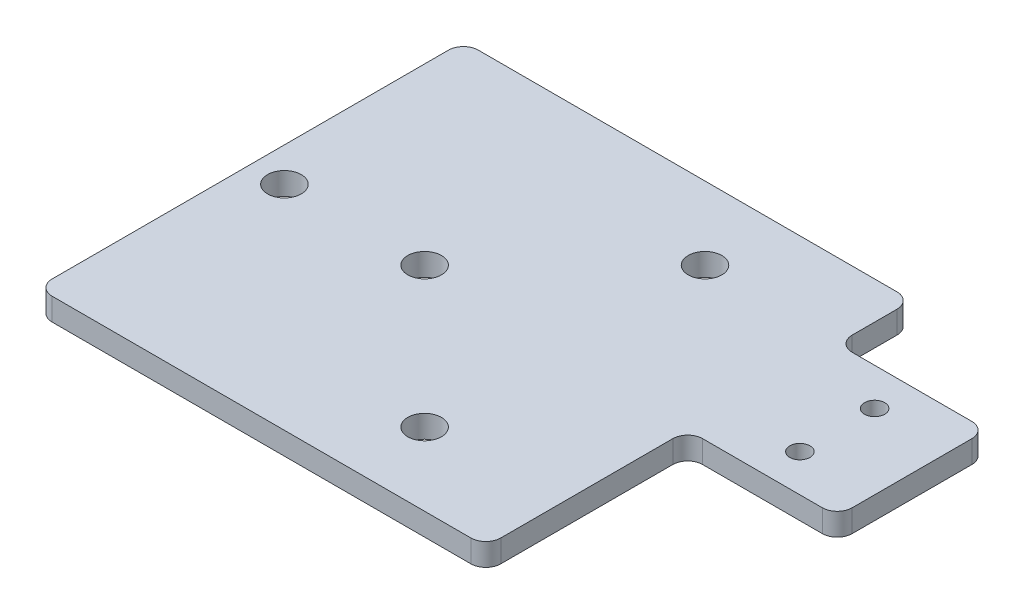
ISO-10303-21;
HEADER;
FILE_DESCRIPTION(('STEP AP214'),'2;1');
FILE_NAME('part.step','',(''),(''),'','','');
FILE_SCHEMA(('AUTOMOTIVE_DESIGN { 1 0 10303 214 1 1 1 1 }'));
ENDSEC;
DATA;
#1=APPLICATION_CONTEXT('core data for automotive mechanical design processes');
#2=APPLICATION_PROTOCOL_DEFINITION('international standard','automotive_design',2000,#1);
#3=PRODUCT_CONTEXT('',#1,'mechanical');
#4=PRODUCT('Part','Part','',(#3));
#5=PRODUCT_RELATED_PRODUCT_CATEGORY('part','',(#4));
#6=PRODUCT_DEFINITION_FORMATION('','',#4);
#7=PRODUCT_DEFINITION_CONTEXT('part definition',#1,'design');
#8=PRODUCT_DEFINITION('design','',#6,#7);
#9=PRODUCT_DEFINITION_SHAPE('','',#8);
#10=(LENGTH_UNIT() NAMED_UNIT(*) SI_UNIT(.MILLI.,.METRE.));
#11=(NAMED_UNIT(*) PLANE_ANGLE_UNIT() SI_UNIT($,.RADIAN.));
#12=(NAMED_UNIT(*) SI_UNIT($,.STERADIAN.) SOLID_ANGLE_UNIT());
#13=UNCERTAINTY_MEASURE_WITH_UNIT(LENGTH_MEASURE(1.E-05),#10,'distance_accuracy_value','');
#14=(GEOMETRIC_REPRESENTATION_CONTEXT(3) GLOBAL_UNCERTAINTY_ASSIGNED_CONTEXT((#13)) GLOBAL_UNIT_ASSIGNED_CONTEXT((#10,
#11,#12)) REPRESENTATION_CONTEXT('',''));
#15=CARTESIAN_POINT('',(0.,0.,0.));
#16=DIRECTION('',(0.,0.,1.));
#17=DIRECTION('',(1.,0.,0.));
#18=AXIS2_PLACEMENT_3D('',#15,#16,#17);
#19=CARTESIAN_POINT('',(30.,3.,-28.5));
#20=DIRECTION('',(-1.,0.,0.));
#21=DIRECTION('',(0.,0.,1.));
#22=AXIS2_PLACEMENT_3D('',#19,#20,#21);
#23=PLANE('',#22);
#24=DIRECTION('',(0.,0.,-1.));
#25=VECTOR('',#24,1.);
#26=CARTESIAN_POINT('',(30.,0.,-28.5));
#27=LINE('',#26,#25);
#28=CARTESIAN_POINT('',(30.,0.,-20.5));
#29=VERTEX_POINT('',#28);
#30=CARTESIAN_POINT('',(30.,0.,-26.5));
#31=VERTEX_POINT('',#30);
#32=EDGE_CURVE('E282',#29,#31,#27,.T.);
#33=ORIENTED_EDGE('',*,*,#32,.T.);
#34=DIRECTION('',(0.,-1.,0.));
#35=VECTOR('',#34,1.);
#36=CARTESIAN_POINT('',(30.,3.,-26.5));
#37=LINE('',#36,#35);
#38=CARTESIAN_POINT('',(30.,3.,-26.5));
#39=VERTEX_POINT('',#38);
#40=EDGE_CURVE('E232',#31,#39,#37,.F.);
#41=ORIENTED_EDGE('',*,*,#40,.T.);
#42=DIRECTION('',(0.,0.,-1.));
#43=VECTOR('',#42,1.);
#44=CARTESIAN_POINT('',(30.,3.,-28.5));
#45=LINE('',#44,#43);
#46=CARTESIAN_POINT('',(30.,3.,-20.5));
#47=VERTEX_POINT('',#46);
#48=EDGE_CURVE('E179',#47,#39,#45,.T.);
#49=ORIENTED_EDGE('',*,*,#48,.F.);
#50=DIRECTION('',(0.,1.,0.));
#51=VECTOR('',#50,1.);
#52=CARTESIAN_POINT('',(30.,3.,-20.5));
#53=LINE('',#52,#51);
#54=EDGE_CURVE('E230',#47,#29,#53,.F.);
#55=ORIENTED_EDGE('',*,*,#54,.T.);
#56=EDGE_LOOP('',(#33,#41,#49,#55));
#57=FACE_BOUND('',#56,.T.);
#58=ADVANCED_FACE('F39',(#57),#23,.F.);
#59=CARTESIAN_POINT('',(30.,0.,26.5));
#60=VERTEX_POINT('',#59);
#61=CARTESIAN_POINT('',(30.,0.,3.49999999999999));
#62=VERTEX_POINT('',#61);
#63=EDGE_CURVE('E277',#60,#62,#27,.T.);
#64=ORIENTED_EDGE('',*,*,#63,.T.);
#65=DIRECTION('',(0.,1.,0.));
#66=VECTOR('',#65,1.);
#67=CARTESIAN_POINT('',(30.,3.,3.5));
#68=LINE('',#67,#66);
#69=CARTESIAN_POINT('',(30.,3.,3.49999999999999));
#70=VERTEX_POINT('',#69);
#71=EDGE_CURVE('E252',#62,#70,#68,.T.);
#72=ORIENTED_EDGE('',*,*,#71,.T.);
#73=CARTESIAN_POINT('',(30.,3.,26.5));
#74=VERTEX_POINT('',#73);
#75=EDGE_CURVE('E182',#74,#70,#45,.T.);
#76=ORIENTED_EDGE('',*,*,#75,.F.);
#77=DIRECTION('',(0.,-1.,0.));
#78=VECTOR('',#77,1.);
#79=CARTESIAN_POINT('',(30.,3.,26.5));
#80=LINE('',#79,#78);
#81=EDGE_CURVE('E249',#74,#60,#80,.T.);
#82=ORIENTED_EDGE('',*,*,#81,.T.);
#83=EDGE_LOOP('',(#64,#72,#76,#82));
#84=FACE_BOUND('',#83,.T.);
#85=ADVANCED_FACE('F280',(#84),#23,.F.);
#86=CARTESIAN_POINT('',(-30.,3.,-28.5));
#87=DIRECTION('',(0.,0.,1.));
#88=DIRECTION('',(1.,0.,0.));
#89=AXIS2_PLACEMENT_3D('',#86,#87,#88);
#90=PLANE('',#89);
#91=DIRECTION('',(-1.,0.,0.));
#92=VECTOR('',#91,1.);
#93=CARTESIAN_POINT('',(-30.,0.,-28.5));
#94=LINE('',#93,#92);
#95=CARTESIAN_POINT('',(28.,0.,-28.5));
#96=VERTEX_POINT('',#95);
#97=CARTESIAN_POINT('',(-28.,0.,-28.5));
#98=VERTEX_POINT('',#97);
#99=EDGE_CURVE('E184',#96,#98,#94,.T.);
#100=ORIENTED_EDGE('',*,*,#99,.T.);
#101=DIRECTION('',(0.,-1.,0.));
#102=VECTOR('',#101,1.);
#103=CARTESIAN_POINT('',(-28.,3.,-28.5));
#104=LINE('',#103,#102);
#105=CARTESIAN_POINT('',(-28.,3.,-28.5));
#106=VERTEX_POINT('',#105);
#107=EDGE_CURVE('E54',#98,#106,#104,.F.);
#108=ORIENTED_EDGE('',*,*,#107,.T.);
#109=DIRECTION('',(-1.,0.,0.));
#110=VECTOR('',#109,1.);
#111=CARTESIAN_POINT('',(-30.,3.,-28.5));
#112=LINE('',#111,#110);
#113=CARTESIAN_POINT('',(28.,3.,-28.5));
#114=VERTEX_POINT('',#113);
#115=EDGE_CURVE('E290',#114,#106,#112,.T.);
#116=ORIENTED_EDGE('',*,*,#115,.F.);
#117=DIRECTION('',(0.,-1.,0.));
#118=VECTOR('',#117,1.);
#119=CARTESIAN_POINT('',(28.,3.,-28.5));
#120=LINE('',#119,#118);
#121=EDGE_CURVE('E226',#114,#96,#120,.T.);
#122=ORIENTED_EDGE('',*,*,#121,.T.);
#123=EDGE_LOOP('',(#100,#108,#116,#122));
#124=FACE_BOUND('',#123,.T.);
#125=ADVANCED_FACE('F364',(#124),#90,.F.);
#126=CARTESIAN_POINT('',(-30.,3.,-28.5));
#127=DIRECTION('',(1.,0.,0.));
#128=DIRECTION('',(0.,0.,-1.));
#129=AXIS2_PLACEMENT_3D('',#126,#127,#128);
#130=PLANE('',#129);
#131=DIRECTION('',(0.,0.,1.));
#132=VECTOR('',#131,1.);
#133=CARTESIAN_POINT('',(-30.,0.,-28.5));
#134=LINE('',#133,#132);
#135=CARTESIAN_POINT('',(-30.,0.,-26.5));
#136=VERTEX_POINT('',#135);
#137=CARTESIAN_POINT('',(-30.,0.,26.5));
#138=VERTEX_POINT('',#137);
#139=EDGE_CURVE('E180',#136,#138,#134,.T.);
#140=ORIENTED_EDGE('',*,*,#139,.T.);
#141=DIRECTION('',(0.,-1.,0.));
#142=VECTOR('',#141,1.);
#143=CARTESIAN_POINT('',(-30.,3.,26.5));
#144=LINE('',#143,#142);
#145=CARTESIAN_POINT('',(-30.,3.,26.5));
#146=VERTEX_POINT('',#145);
#147=EDGE_CURVE('E158',#138,#146,#144,.F.);
#148=ORIENTED_EDGE('',*,*,#147,.T.);
#149=DIRECTION('',(0.,0.,1.));
#150=VECTOR('',#149,1.);
#151=CARTESIAN_POINT('',(-30.,3.,-28.5));
#152=LINE('',#151,#150);
#153=CARTESIAN_POINT('',(-30.,3.,-26.5));
#154=VERTEX_POINT('',#153);
#155=EDGE_CURVE('E288',#154,#146,#152,.T.);
#156=ORIENTED_EDGE('',*,*,#155,.F.);
#157=DIRECTION('',(0.,-1.,0.));
#158=VECTOR('',#157,1.);
#159=CARTESIAN_POINT('',(-30.,3.,-26.5));
#160=LINE('',#159,#158);
#161=EDGE_CURVE('E163',#154,#136,#160,.T.);
#162=ORIENTED_EDGE('',*,*,#161,.T.);
#163=EDGE_LOOP('',(#140,#148,#156,#162));
#164=FACE_BOUND('',#163,.T.);
#165=ADVANCED_FACE('F401',(#164),#130,.F.);
#166=CARTESIAN_POINT('',(-30.,3.,28.5));
#167=DIRECTION('',(0.,0.,-1.));
#168=DIRECTION('',(-1.,0.,0.));
#169=AXIS2_PLACEMENT_3D('',#166,#167,#168);
#170=PLANE('',#169);
#171=DIRECTION('',(1.,0.,0.));
#172=VECTOR('',#171,1.);
#173=CARTESIAN_POINT('',(-30.,3.,28.5));
#174=LINE('',#173,#172);
#175=CARTESIAN_POINT('',(-28.,3.,28.5));
#176=VERTEX_POINT('',#175);
#177=CARTESIAN_POINT('',(28.,3.,28.5));
#178=VERTEX_POINT('',#177);
#179=EDGE_CURVE('E173',#176,#178,#174,.T.);
#180=ORIENTED_EDGE('',*,*,#179,.F.);
#181=DIRECTION('',(0.,-1.,0.));
#182=VECTOR('',#181,1.);
#183=CARTESIAN_POINT('',(-28.,3.,28.5));
#184=LINE('',#183,#182);
#185=CARTESIAN_POINT('',(-28.,0.,28.5));
#186=VERTEX_POINT('',#185);
#187=EDGE_CURVE('E157',#176,#186,#184,.T.);
#188=ORIENTED_EDGE('',*,*,#187,.T.);
#189=DIRECTION('',(1.,0.,0.));
#190=VECTOR('',#189,1.);
#191=CARTESIAN_POINT('',(-30.,0.,28.5));
#192=LINE('',#191,#190);
#193=CARTESIAN_POINT('',(28.,0.,28.5));
#194=VERTEX_POINT('',#193);
#195=EDGE_CURVE('E170',#186,#194,#192,.T.);
#196=ORIENTED_EDGE('',*,*,#195,.T.);
#197=DIRECTION('',(0.,-1.,0.));
#198=VECTOR('',#197,1.);
#199=CARTESIAN_POINT('',(28.,3.,28.5));
#200=LINE('',#199,#198);
#201=EDGE_CURVE('E175',#194,#178,#200,.F.);
#202=ORIENTED_EDGE('',*,*,#201,.T.);
#203=EDGE_LOOP('',(#180,#188,#196,#202));
#204=FACE_BOUND('',#203,.T.);
#205=ADVANCED_FACE('F169',(#204),#170,.F.);
#206=CARTESIAN_POINT('',(0.,3.,0.));
#207=DIRECTION('',(0.,1.,0.));
#208=DIRECTION('',(0.,0.,1.));
#209=AXIS2_PLACEMENT_3D('',#206,#207,#208);
#210=PLANE('',#209);
#211=CARTESIAN_POINT('',(40.,3.,-3.5));
#212=DIRECTION('',(0.,1.,0.));
#213=DIRECTION('',(0.,0.,1.));
#214=AXIS2_PLACEMENT_3D('',#211,#212,#213);
#215=CIRCLE('',#214,1.35);
#216=CARTESIAN_POINT('',(40.,3.,-2.15000000000001));
#217=VERTEX_POINT('',#216);
#218=EDGE_CURVE('E322',#217,#217,#215,.T.);
#219=ORIENTED_EDGE('',*,*,#218,.F.);
#220=EDGE_LOOP('',(#219));
#221=FACE_BOUND('',#220,.T.);
#222=CARTESIAN_POINT('',(40.,3.,-13.5));
#223=DIRECTION('',(0.,1.,0.));
#224=DIRECTION('',(0.,0.,1.));
#225=AXIS2_PLACEMENT_3D('',#222,#223,#224);
#226=CIRCLE('',#225,1.35);
#227=CARTESIAN_POINT('',(40.,3.,-12.15));
#228=VERTEX_POINT('',#227);
#229=EDGE_CURVE('E202',#228,#228,#226,.T.);
#230=ORIENTED_EDGE('',*,*,#229,.F.);
#231=EDGE_LOOP('',(#230));
#232=FACE_BOUND('',#231,.T.);
#233=CARTESIAN_POINT('',(-25.437,3.,0.));
#234=DIRECTION('',(0.,1.,0.));
#235=DIRECTION('',(0.,0.,1.));
#236=AXIS2_PLACEMENT_3D('',#233,#234,#235);
#237=CIRCLE('',#236,2.25);
#238=CARTESIAN_POINT('',(-25.437,3.,2.25));
#239=VERTEX_POINT('',#238);
#240=EDGE_CURVE('E197',#239,#239,#237,.T.);
#241=ORIENTED_EDGE('',*,*,#240,.F.);
#242=EDGE_LOOP('',(#241));
#243=FACE_BOUND('',#242,.T.);
#244=CARTESIAN_POINT('',(-6.68699999999999,3.,0.));
#245=DIRECTION('',(0.,1.,0.));
#246=DIRECTION('',(0.,0.,1.));
#247=AXIS2_PLACEMENT_3D('',#244,#245,#246);
#248=CIRCLE('',#247,2.25);
#249=CARTESIAN_POINT('',(-6.68699999999999,3.,2.25));
#250=VERTEX_POINT('',#249);
#251=EDGE_CURVE('E196',#250,#250,#248,.T.);
#252=ORIENTED_EDGE('',*,*,#251,.F.);
#253=EDGE_LOOP('',(#252));
#254=FACE_BOUND('',#253,.T.);
#255=CARTESIAN_POINT('',(12.063,3.,-18.75));
#256=DIRECTION('',(0.,1.,0.));
#257=DIRECTION('',(0.,0.,1.));
#258=AXIS2_PLACEMENT_3D('',#255,#256,#257);
#259=CIRCLE('',#258,2.25);
#260=CARTESIAN_POINT('',(12.063,3.,-16.5));
#261=VERTEX_POINT('',#260);
#262=EDGE_CURVE('E192',#261,#261,#259,.T.);
#263=ORIENTED_EDGE('',*,*,#262,.F.);
#264=EDGE_LOOP('',(#263));
#265=FACE_BOUND('',#264,.T.);
#266=CARTESIAN_POINT('',(12.063,3.,18.75));
#267=DIRECTION('',(0.,1.,0.));
#268=DIRECTION('',(0.,0.,1.));
#269=AXIS2_PLACEMENT_3D('',#266,#267,#268);
#270=CIRCLE('',#269,2.25);
#271=CARTESIAN_POINT('',(12.063,3.,21.));
#272=VERTEX_POINT('',#271);
#273=EDGE_CURVE('E191',#272,#272,#270,.T.);
#274=ORIENTED_EDGE('',*,*,#273,.F.);
#275=EDGE_LOOP('',(#274));
#276=FACE_BOUND('',#275,.T.);
#277=ORIENTED_EDGE('',*,*,#155,.T.);
#278=CARTESIAN_POINT('',(-28.,3.,26.5));
#279=DIRECTION('',(0.,1.,0.));
#280=DIRECTION('',(0.,0.,1.));
#281=AXIS2_PLACEMENT_3D('',#278,#279,#280);
#282=CIRCLE('',#281,2.);
#283=EDGE_CURVE('E224',#146,#176,#282,.T.);
#284=ORIENTED_EDGE('',*,*,#283,.T.);
#285=ORIENTED_EDGE('',*,*,#179,.T.);
#286=CARTESIAN_POINT('',(28.,3.,26.5));
#287=DIRECTION('',(0.,1.,0.));
#288=DIRECTION('',(0.,0.,1.));
#289=AXIS2_PLACEMENT_3D('',#286,#287,#288);
#290=CIRCLE('',#289,2.);
#291=EDGE_CURVE('E215',#178,#74,#290,.T.);
#292=ORIENTED_EDGE('',*,*,#291,.T.);
#293=ORIENTED_EDGE('',*,*,#75,.T.);
#294=CARTESIAN_POINT('',(32.,3.,3.5));
#295=DIRECTION('',(0.,1.,0.));
#296=DIRECTION('',(0.,0.,1.));
#297=AXIS2_PLACEMENT_3D('',#294,#295,#296);
#298=CIRCLE('',#297,2.);
#299=CARTESIAN_POINT('',(32.,3.,1.5));
#300=VERTEX_POINT('',#299);
#301=EDGE_CURVE('E47',#70,#300,#298,.F.);
#302=ORIENTED_EDGE('',*,*,#301,.T.);
#303=DIRECTION('',(1.,0.,0.));
#304=VECTOR('',#303,1.);
#305=CARTESIAN_POINT('',(50.,3.,1.5));
#306=LINE('',#305,#304);
#307=CARTESIAN_POINT('',(48.,3.,1.5));
#308=VERTEX_POINT('',#307);
#309=EDGE_CURVE('E201',#300,#308,#306,.T.);
#310=ORIENTED_EDGE('',*,*,#309,.T.);
#311=CARTESIAN_POINT('',(48.,3.,-0.500000000000002));
#312=DIRECTION('',(0.,1.,0.));
#313=DIRECTION('',(0.,0.,1.));
#314=AXIS2_PLACEMENT_3D('',#311,#312,#313);
#315=CIRCLE('',#314,2.);
#316=CARTESIAN_POINT('',(50.,3.,-0.500000000000003));
#317=VERTEX_POINT('',#316);
#318=EDGE_CURVE('E217',#308,#317,#315,.T.);
#319=ORIENTED_EDGE('',*,*,#318,.T.);
#320=DIRECTION('',(0.,0.,-1.));
#321=VECTOR('',#320,1.);
#322=CARTESIAN_POINT('',(50.,3.,1.5));
#323=LINE('',#322,#321);
#324=CARTESIAN_POINT('',(50.,3.,-16.5));
#325=VERTEX_POINT('',#324);
#326=EDGE_CURVE('E272',#317,#325,#323,.T.);
#327=ORIENTED_EDGE('',*,*,#326,.T.);
#328=CARTESIAN_POINT('',(48.,3.,-16.5));
#329=DIRECTION('',(0.,1.,0.));
#330=DIRECTION('',(0.,0.,1.));
#331=AXIS2_PLACEMENT_3D('',#328,#329,#330);
#332=CIRCLE('',#331,2.);
#333=CARTESIAN_POINT('',(48.,3.,-18.5));
#334=VERTEX_POINT('',#333);
#335=EDGE_CURVE('E219',#325,#334,#332,.T.);
#336=ORIENTED_EDGE('',*,*,#335,.T.);
#337=DIRECTION('',(-1.,0.,0.));
#338=VECTOR('',#337,1.);
#339=CARTESIAN_POINT('',(50.,3.,-18.5));
#340=LINE('',#339,#338);
#341=CARTESIAN_POINT('',(32.,3.,-18.5));
#342=VERTEX_POINT('',#341);
#343=EDGE_CURVE('E306',#334,#342,#340,.T.);
#344=ORIENTED_EDGE('',*,*,#343,.T.);
#345=CARTESIAN_POINT('',(32.,3.,-20.5));
#346=DIRECTION('',(0.,1.,0.));
#347=DIRECTION('',(0.,0.,1.));
#348=AXIS2_PLACEMENT_3D('',#345,#346,#347);
#349=CIRCLE('',#348,2.);
#350=EDGE_CURVE('E255',#342,#47,#349,.F.);
#351=ORIENTED_EDGE('',*,*,#350,.T.);
#352=ORIENTED_EDGE('',*,*,#48,.T.);
#353=CARTESIAN_POINT('',(28.,3.,-26.5));
#354=DIRECTION('',(0.,1.,0.));
#355=DIRECTION('',(0.,0.,1.));
#356=AXIS2_PLACEMENT_3D('',#353,#354,#355);
#357=CIRCLE('',#356,2.);
#358=EDGE_CURVE('E61',#39,#114,#357,.T.);
#359=ORIENTED_EDGE('',*,*,#358,.T.);
#360=ORIENTED_EDGE('',*,*,#115,.T.);
#361=CARTESIAN_POINT('',(-28.,3.,-26.5));
#362=DIRECTION('',(0.,1.,0.));
#363=DIRECTION('',(0.,0.,1.));
#364=AXIS2_PLACEMENT_3D('',#361,#362,#363);
#365=CIRCLE('',#364,2.);
#366=EDGE_CURVE('E222',#106,#154,#365,.T.);
#367=ORIENTED_EDGE('',*,*,#366,.T.);
#368=EDGE_LOOP('',(#277,#284,#285,#292,#293,#302,#310,#319,#327,#336,#344,#351,#352,#359,#360,#367));
#369=FACE_BOUND('',#368,.T.);
#370=ADVANCED_FACE('F262',(#221,#232,#243,#254,#265,#276,#369),#210,.T.);
#371=CARTESIAN_POINT('',(0.,0.,0.));
#372=DIRECTION('',(0.,1.,0.));
#373=DIRECTION('',(0.,0.,1.));
#374=AXIS2_PLACEMENT_3D('',#371,#372,#373);
#375=PLANE('',#374);
#376=CARTESIAN_POINT('',(40.,0.,-3.5));
#377=DIRECTION('',(0.,1.,0.));
#378=DIRECTION('',(0.,0.,1.));
#379=AXIS2_PLACEMENT_3D('',#376,#377,#378);
#380=CIRCLE('',#379,1.35);
#381=CARTESIAN_POINT('',(40.,0.,-2.15000000000001));
#382=VERTEX_POINT('',#381);
#383=EDGE_CURVE('E319',#382,#382,#380,.T.);
#384=ORIENTED_EDGE('',*,*,#383,.T.);
#385=EDGE_LOOP('',(#384));
#386=FACE_BOUND('',#385,.T.);
#387=CARTESIAN_POINT('',(40.,0.,-13.5));
#388=DIRECTION('',(0.,1.,0.));
#389=DIRECTION('',(0.,0.,1.));
#390=AXIS2_PLACEMENT_3D('',#387,#388,#389);
#391=CIRCLE('',#390,1.35);
#392=CARTESIAN_POINT('',(40.,0.,-12.15));
#393=VERTEX_POINT('',#392);
#394=EDGE_CURVE('E198',#393,#393,#391,.T.);
#395=ORIENTED_EDGE('',*,*,#394,.T.);
#396=EDGE_LOOP('',(#395));
#397=FACE_BOUND('',#396,.T.);
#398=CARTESIAN_POINT('',(-25.437,0.,0.));
#399=DIRECTION('',(0.,1.,0.));
#400=DIRECTION('',(0.,0.,1.));
#401=AXIS2_PLACEMENT_3D('',#398,#399,#400);
#402=CIRCLE('',#401,2.25);
#403=CARTESIAN_POINT('',(-25.437,0.,2.25));
#404=VERTEX_POINT('',#403);
#405=EDGE_CURVE('E193',#404,#404,#402,.T.);
#406=ORIENTED_EDGE('',*,*,#405,.T.);
#407=EDGE_LOOP('',(#406));
#408=FACE_BOUND('',#407,.T.);
#409=CARTESIAN_POINT('',(-6.68699999999999,0.,0.));
#410=DIRECTION('',(0.,1.,0.));
#411=DIRECTION('',(0.,0.,1.));
#412=AXIS2_PLACEMENT_3D('',#409,#410,#411);
#413=CIRCLE('',#412,2.25);
#414=CARTESIAN_POINT('',(-6.68699999999999,0.,2.25));
#415=VERTEX_POINT('',#414);
#416=EDGE_CURVE('E298',#415,#415,#413,.T.);
#417=ORIENTED_EDGE('',*,*,#416,.T.);
#418=EDGE_LOOP('',(#417));
#419=FACE_BOUND('',#418,.T.);
#420=CARTESIAN_POINT('',(12.063,0.,-18.75));
#421=DIRECTION('',(0.,1.,0.));
#422=DIRECTION('',(0.,0.,1.));
#423=AXIS2_PLACEMENT_3D('',#420,#421,#422);
#424=CIRCLE('',#423,2.25);
#425=CARTESIAN_POINT('',(12.063,0.,-16.5));
#426=VERTEX_POINT('',#425);
#427=EDGE_CURVE('E188',#426,#426,#424,.T.);
#428=ORIENTED_EDGE('',*,*,#427,.T.);
#429=EDGE_LOOP('',(#428));
#430=FACE_BOUND('',#429,.T.);
#431=CARTESIAN_POINT('',(12.063,0.,18.75));
#432=DIRECTION('',(0.,1.,0.));
#433=DIRECTION('',(0.,0.,1.));
#434=AXIS2_PLACEMENT_3D('',#431,#432,#433);
#435=CIRCLE('',#434,2.25);
#436=CARTESIAN_POINT('',(12.063,0.,21.));
#437=VERTEX_POINT('',#436);
#438=EDGE_CURVE('E285',#437,#437,#435,.T.);
#439=ORIENTED_EDGE('',*,*,#438,.T.);
#440=EDGE_LOOP('',(#439));
#441=FACE_BOUND('',#440,.T.);
#442=ORIENTED_EDGE('',*,*,#195,.F.);
#443=CARTESIAN_POINT('',(-28.,0.,26.5));
#444=DIRECTION('',(0.,1.,0.));
#445=DIRECTION('',(0.,0.,1.));
#446=AXIS2_PLACEMENT_3D('',#443,#444,#445);
#447=CIRCLE('',#446,2.);
#448=EDGE_CURVE('E153',#186,#138,#447,.F.);
#449=ORIENTED_EDGE('',*,*,#448,.T.);
#450=ORIENTED_EDGE('',*,*,#139,.F.);
#451=CARTESIAN_POINT('',(-28.,0.,-26.5));
#452=DIRECTION('',(0.,1.,0.));
#453=DIRECTION('',(0.,0.,1.));
#454=AXIS2_PLACEMENT_3D('',#451,#452,#453);
#455=CIRCLE('',#454,2.);
#456=EDGE_CURVE('E164',#136,#98,#455,.F.);
#457=ORIENTED_EDGE('',*,*,#456,.T.);
#458=ORIENTED_EDGE('',*,*,#99,.F.);
#459=CARTESIAN_POINT('',(28.,0.,-26.5));
#460=DIRECTION('',(0.,1.,0.));
#461=DIRECTION('',(0.,0.,1.));
#462=AXIS2_PLACEMENT_3D('',#459,#460,#461);
#463=CIRCLE('',#462,2.);
#464=EDGE_CURVE('E209',#96,#31,#463,.F.);
#465=ORIENTED_EDGE('',*,*,#464,.T.);
#466=ORIENTED_EDGE('',*,*,#32,.F.);
#467=CARTESIAN_POINT('',(32.,0.,-20.5));
#468=DIRECTION('',(0.,1.,0.));
#469=DIRECTION('',(0.,0.,1.));
#470=AXIS2_PLACEMENT_3D('',#467,#468,#469);
#471=CIRCLE('',#470,2.);
#472=CARTESIAN_POINT('',(32.,0.,-18.5));
#473=VERTEX_POINT('',#472);
#474=EDGE_CURVE('E257',#29,#473,#471,.T.);
#475=ORIENTED_EDGE('',*,*,#474,.T.);
#476=DIRECTION('',(-1.,0.,0.));
#477=VECTOR('',#476,1.);
#478=CARTESIAN_POINT('',(50.,0.,-18.5));
#479=LINE('',#478,#477);
#480=CARTESIAN_POINT('',(48.,0.,-18.5));
#481=VERTEX_POINT('',#480);
#482=EDGE_CURVE('E305',#481,#473,#479,.T.);
#483=ORIENTED_EDGE('',*,*,#482,.F.);
#484=CARTESIAN_POINT('',(48.,0.,-16.5));
#485=DIRECTION('',(0.,1.,0.));
#486=DIRECTION('',(0.,0.,1.));
#487=AXIS2_PLACEMENT_3D('',#484,#485,#486);
#488=CIRCLE('',#487,2.);
#489=CARTESIAN_POINT('',(50.,0.,-16.5));
#490=VERTEX_POINT('',#489);
#491=EDGE_CURVE('E207',#481,#490,#488,.F.);
#492=ORIENTED_EDGE('',*,*,#491,.T.);
#493=DIRECTION('',(0.,0.,-1.));
#494=VECTOR('',#493,1.);
#495=CARTESIAN_POINT('',(50.,0.,1.5));
#496=LINE('',#495,#494);
#497=CARTESIAN_POINT('',(50.,0.,-0.500000000000003));
#498=VERTEX_POINT('',#497);
#499=EDGE_CURVE('E313',#498,#490,#496,.T.);
#500=ORIENTED_EDGE('',*,*,#499,.F.);
#501=CARTESIAN_POINT('',(48.,0.,-0.500000000000002));
#502=DIRECTION('',(0.,1.,0.));
#503=DIRECTION('',(0.,0.,1.));
#504=AXIS2_PLACEMENT_3D('',#501,#502,#503);
#505=CIRCLE('',#504,2.);
#506=CARTESIAN_POINT('',(48.,0.,1.5));
#507=VERTEX_POINT('',#506);
#508=EDGE_CURVE('E205',#498,#507,#505,.F.);
#509=ORIENTED_EDGE('',*,*,#508,.T.);
#510=DIRECTION('',(1.,0.,0.));
#511=VECTOR('',#510,1.);
#512=CARTESIAN_POINT('',(50.,0.,1.5));
#513=LINE('',#512,#511);
#514=CARTESIAN_POINT('',(32.,0.,1.5));
#515=VERTEX_POINT('',#514);
#516=EDGE_CURVE('E278',#515,#507,#513,.T.);
#517=ORIENTED_EDGE('',*,*,#516,.F.);
#518=CARTESIAN_POINT('',(32.,0.,3.5));
#519=DIRECTION('',(0.,1.,0.));
#520=DIRECTION('',(0.,0.,1.));
#521=AXIS2_PLACEMENT_3D('',#518,#519,#520);
#522=CIRCLE('',#521,2.);
#523=EDGE_CURVE('E11',#515,#62,#522,.T.);
#524=ORIENTED_EDGE('',*,*,#523,.T.);
#525=ORIENTED_EDGE('',*,*,#63,.F.);
#526=CARTESIAN_POINT('',(28.,0.,26.5));
#527=DIRECTION('',(0.,1.,0.));
#528=DIRECTION('',(0.,0.,1.));
#529=AXIS2_PLACEMENT_3D('',#526,#527,#528);
#530=CIRCLE('',#529,2.);
#531=EDGE_CURVE('E174',#60,#194,#530,.F.);
#532=ORIENTED_EDGE('',*,*,#531,.T.);
#533=EDGE_LOOP('',(#442,#449,#450,#457,#458,#465,#466,#475,#483,#492,#500,#509,#517,#524,#525,#532));
#534=FACE_BOUND('',#533,.T.);
#535=ADVANCED_FACE('F177',(#386,#397,#408,#419,#430,#441,#534),#375,.F.);
#536=CARTESIAN_POINT('',(12.063,3.,18.75));
#537=DIRECTION('',(0.,1.,0.));
#538=DIRECTION('',(0.,0.,1.));
#539=AXIS2_PLACEMENT_3D('',#536,#537,#538);
#540=CYLINDRICAL_SURFACE('',#539,2.25);
#541=ORIENTED_EDGE('',*,*,#273,.T.);
#542=EDGE_LOOP('',(#541));
#543=FACE_BOUND('',#542,.T.);
#544=ORIENTED_EDGE('',*,*,#438,.F.);
#545=EDGE_LOOP('',(#544));
#546=FACE_BOUND('',#545,.T.);
#547=ADVANCED_FACE('F342',(#543,#546),#540,.F.);
#548=CARTESIAN_POINT('',(12.063,3.,-18.75));
#549=DIRECTION('',(0.,1.,0.));
#550=DIRECTION('',(0.,0.,1.));
#551=AXIS2_PLACEMENT_3D('',#548,#549,#550);
#552=CYLINDRICAL_SURFACE('',#551,2.25);
#553=ORIENTED_EDGE('',*,*,#262,.T.);
#554=EDGE_LOOP('',(#553));
#555=FACE_BOUND('',#554,.T.);
#556=ORIENTED_EDGE('',*,*,#427,.F.);
#557=EDGE_LOOP('',(#556));
#558=FACE_BOUND('',#557,.T.);
#559=ADVANCED_FACE('F345',(#555,#558),#552,.F.);
#560=CARTESIAN_POINT('',(-6.68699999999999,3.,0.));
#561=DIRECTION('',(0.,1.,0.));
#562=DIRECTION('',(0.,0.,1.));
#563=AXIS2_PLACEMENT_3D('',#560,#561,#562);
#564=CYLINDRICAL_SURFACE('',#563,2.25);
#565=ORIENTED_EDGE('',*,*,#251,.T.);
#566=EDGE_LOOP('',(#565));
#567=FACE_BOUND('',#566,.T.);
#568=ORIENTED_EDGE('',*,*,#416,.F.);
#569=EDGE_LOOP('',(#568));
#570=FACE_BOUND('',#569,.T.);
#571=ADVANCED_FACE('F436',(#567,#570),#564,.F.);
#572=CARTESIAN_POINT('',(-25.437,3.,0.));
#573=DIRECTION('',(0.,1.,0.));
#574=DIRECTION('',(0.,0.,1.));
#575=AXIS2_PLACEMENT_3D('',#572,#573,#574);
#576=CYLINDRICAL_SURFACE('',#575,2.25);
#577=ORIENTED_EDGE('',*,*,#240,.T.);
#578=EDGE_LOOP('',(#577));
#579=FACE_BOUND('',#578,.T.);
#580=ORIENTED_EDGE('',*,*,#405,.F.);
#581=EDGE_LOOP('',(#580));
#582=FACE_BOUND('',#581,.T.);
#583=ADVANCED_FACE('F430',(#579,#582),#576,.F.);
#584=CARTESIAN_POINT('',(50.,0.,-18.5));
#585=DIRECTION('',(0.,0.,-1.));
#586=DIRECTION('',(-1.,0.,0.));
#587=AXIS2_PLACEMENT_3D('',#584,#585,#586);
#588=PLANE('',#587);
#589=ORIENTED_EDGE('',*,*,#482,.T.);
#590=DIRECTION('',(0.,1.,0.));
#591=VECTOR('',#590,1.);
#592=CARTESIAN_POINT('',(32.,0.,-18.5));
#593=LINE('',#592,#591);
#594=EDGE_CURVE('E236',#473,#342,#593,.T.);
#595=ORIENTED_EDGE('',*,*,#594,.T.);
#596=ORIENTED_EDGE('',*,*,#343,.F.);
#597=DIRECTION('',(0.,1.,0.));
#598=VECTOR('',#597,1.);
#599=CARTESIAN_POINT('',(48.,0.,-18.5));
#600=LINE('',#599,#598);
#601=EDGE_CURVE('E234',#334,#481,#600,.F.);
#602=ORIENTED_EDGE('',*,*,#601,.T.);
#603=EDGE_LOOP('',(#589,#595,#596,#602));
#604=FACE_BOUND('',#603,.T.);
#605=ADVANCED_FACE('F413',(#604),#588,.T.);
#606=CARTESIAN_POINT('',(50.,0.,1.5));
#607=DIRECTION('',(1.,0.,0.));
#608=DIRECTION('',(0.,0.,-1.));
#609=AXIS2_PLACEMENT_3D('',#606,#607,#608);
#610=PLANE('',#609);
#611=ORIENTED_EDGE('',*,*,#499,.T.);
#612=DIRECTION('',(0.,1.,0.));
#613=VECTOR('',#612,1.);
#614=CARTESIAN_POINT('',(50.,0.,-16.5));
#615=LINE('',#614,#613);
#616=EDGE_CURVE('E241',#490,#325,#615,.T.);
#617=ORIENTED_EDGE('',*,*,#616,.T.);
#618=ORIENTED_EDGE('',*,*,#326,.F.);
#619=DIRECTION('',(0.,1.,0.));
#620=VECTOR('',#619,1.);
#621=CARTESIAN_POINT('',(50.,0.,-0.500000000000003));
#622=LINE('',#621,#620);
#623=EDGE_CURVE('E239',#317,#498,#622,.F.);
#624=ORIENTED_EDGE('',*,*,#623,.T.);
#625=EDGE_LOOP('',(#611,#617,#618,#624));
#626=FACE_BOUND('',#625,.T.);
#627=ADVANCED_FACE('F420',(#626),#610,.T.);
#628=CARTESIAN_POINT('',(50.,0.,1.5));
#629=DIRECTION('',(0.,0.,1.));
#630=DIRECTION('',(1.,0.,0.));
#631=AXIS2_PLACEMENT_3D('',#628,#629,#630);
#632=PLANE('',#631);
#633=ORIENTED_EDGE('',*,*,#516,.T.);
#634=DIRECTION('',(0.,1.,0.));
#635=VECTOR('',#634,1.);
#636=CARTESIAN_POINT('',(48.,0.,1.5));
#637=LINE('',#636,#635);
#638=EDGE_CURVE('E246',#507,#308,#637,.T.);
#639=ORIENTED_EDGE('',*,*,#638,.T.);
#640=ORIENTED_EDGE('',*,*,#309,.F.);
#641=DIRECTION('',(0.,1.,0.));
#642=VECTOR('',#641,1.);
#643=CARTESIAN_POINT('',(32.,0.,1.5));
#644=LINE('',#643,#642);
#645=EDGE_CURVE('E244',#300,#515,#644,.F.);
#646=ORIENTED_EDGE('',*,*,#645,.T.);
#647=EDGE_LOOP('',(#633,#639,#640,#646));
#648=FACE_BOUND('',#647,.T.);
#649=ADVANCED_FACE('F269',(#648),#632,.T.);
#650=CARTESIAN_POINT('',(40.,3.,-13.5));
#651=DIRECTION('',(0.,1.,0.));
#652=DIRECTION('',(0.,0.,1.));
#653=AXIS2_PLACEMENT_3D('',#650,#651,#652);
#654=CYLINDRICAL_SURFACE('',#653,1.35);
#655=ORIENTED_EDGE('',*,*,#229,.T.);
#656=EDGE_LOOP('',(#655));
#657=FACE_BOUND('',#656,.T.);
#658=ORIENTED_EDGE('',*,*,#394,.F.);
#659=EDGE_LOOP('',(#658));
#660=FACE_BOUND('',#659,.T.);
#661=ADVANCED_FACE('F428',(#657,#660),#654,.F.);
#662=CARTESIAN_POINT('',(40.,3.,-3.5));
#663=DIRECTION('',(0.,1.,0.));
#664=DIRECTION('',(0.,0.,1.));
#665=AXIS2_PLACEMENT_3D('',#662,#663,#664);
#666=CYLINDRICAL_SURFACE('',#665,1.35);
#667=ORIENTED_EDGE('',*,*,#218,.T.);
#668=EDGE_LOOP('',(#667));
#669=FACE_BOUND('',#668,.T.);
#670=ORIENTED_EDGE('',*,*,#383,.F.);
#671=EDGE_LOOP('',(#670));
#672=FACE_BOUND('',#671,.T.);
#673=ADVANCED_FACE('F326',(#669,#672),#666,.F.);
#674=CARTESIAN_POINT('',(-28.,3.,26.5));
#675=DIRECTION('',(0.,-1.,0.));
#676=DIRECTION('',(0.,0.,-1.));
#677=AXIS2_PLACEMENT_3D('',#674,#675,#676);
#678=CYLINDRICAL_SURFACE('',#677,2.);
#679=ORIENTED_EDGE('',*,*,#283,.F.);
#680=ORIENTED_EDGE('',*,*,#147,.F.);
#681=ORIENTED_EDGE('',*,*,#448,.F.);
#682=ORIENTED_EDGE('',*,*,#187,.F.);
#683=EDGE_LOOP('',(#679,#680,#681,#682));
#684=FACE_BOUND('',#683,.T.);
#685=ADVANCED_FACE('F156',(#684),#678,.T.);
#686=CARTESIAN_POINT('',(-28.,3.,-26.5));
#687=DIRECTION('',(0.,-1.,0.));
#688=DIRECTION('',(0.,0.,-1.));
#689=AXIS2_PLACEMENT_3D('',#686,#687,#688);
#690=CYLINDRICAL_SURFACE('',#689,2.);
#691=ORIENTED_EDGE('',*,*,#366,.F.);
#692=ORIENTED_EDGE('',*,*,#107,.F.);
#693=ORIENTED_EDGE('',*,*,#456,.F.);
#694=ORIENTED_EDGE('',*,*,#161,.F.);
#695=EDGE_LOOP('',(#691,#692,#693,#694));
#696=FACE_BOUND('',#695,.T.);
#697=ADVANCED_FACE('F370',(#696),#690,.T.);
#698=CARTESIAN_POINT('',(28.,3.,-26.5));
#699=DIRECTION('',(0.,-1.,0.));
#700=DIRECTION('',(0.,0.,-1.));
#701=AXIS2_PLACEMENT_3D('',#698,#699,#700);
#702=CYLINDRICAL_SURFACE('',#701,2.);
#703=ORIENTED_EDGE('',*,*,#358,.F.);
#704=ORIENTED_EDGE('',*,*,#40,.F.);
#705=ORIENTED_EDGE('',*,*,#464,.F.);
#706=ORIENTED_EDGE('',*,*,#121,.F.);
#707=EDGE_LOOP('',(#703,#704,#705,#706));
#708=FACE_BOUND('',#707,.T.);
#709=ADVANCED_FACE('F373',(#708),#702,.T.);
#710=CARTESIAN_POINT('',(32.,0.,-20.5));
#711=DIRECTION('',(0.,1.,0.));
#712=DIRECTION('',(0.,0.,1.));
#713=AXIS2_PLACEMENT_3D('',#710,#711,#712);
#714=CYLINDRICAL_SURFACE('',#713,2.);
#715=ORIENTED_EDGE('',*,*,#474,.F.);
#716=ORIENTED_EDGE('',*,*,#54,.F.);
#717=ORIENTED_EDGE('',*,*,#350,.F.);
#718=ORIENTED_EDGE('',*,*,#594,.F.);
#719=EDGE_LOOP('',(#715,#716,#717,#718));
#720=FACE_BOUND('',#719,.T.);
#721=ADVANCED_FACE('F377',(#720),#714,.F.);
#722=CARTESIAN_POINT('',(48.,0.,-16.5));
#723=DIRECTION('',(0.,1.,0.));
#724=DIRECTION('',(0.,0.,1.));
#725=AXIS2_PLACEMENT_3D('',#722,#723,#724);
#726=CYLINDRICAL_SURFACE('',#725,2.);
#727=ORIENTED_EDGE('',*,*,#491,.F.);
#728=ORIENTED_EDGE('',*,*,#601,.F.);
#729=ORIENTED_EDGE('',*,*,#335,.F.);
#730=ORIENTED_EDGE('',*,*,#616,.F.);
#731=EDGE_LOOP('',(#727,#728,#729,#730));
#732=FACE_BOUND('',#731,.T.);
#733=ADVANCED_FACE('F381',(#732),#726,.T.);
#734=CARTESIAN_POINT('',(48.,0.,-0.500000000000002));
#735=DIRECTION('',(0.,1.,0.));
#736=DIRECTION('',(0.,0.,1.));
#737=AXIS2_PLACEMENT_3D('',#734,#735,#736);
#738=CYLINDRICAL_SURFACE('',#737,2.);
#739=ORIENTED_EDGE('',*,*,#508,.F.);
#740=ORIENTED_EDGE('',*,*,#623,.F.);
#741=ORIENTED_EDGE('',*,*,#318,.F.);
#742=ORIENTED_EDGE('',*,*,#638,.F.);
#743=EDGE_LOOP('',(#739,#740,#741,#742));
#744=FACE_BOUND('',#743,.T.);
#745=ADVANCED_FACE('F385',(#744),#738,.T.);
#746=CARTESIAN_POINT('',(32.,3.,3.5));
#747=DIRECTION('',(0.,1.,0.));
#748=DIRECTION('',(0.,0.,1.));
#749=AXIS2_PLACEMENT_3D('',#746,#747,#748);
#750=CYLINDRICAL_SURFACE('',#749,2.);
#751=ORIENTED_EDGE('',*,*,#523,.F.);
#752=ORIENTED_EDGE('',*,*,#645,.F.);
#753=ORIENTED_EDGE('',*,*,#301,.F.);
#754=ORIENTED_EDGE('',*,*,#71,.F.);
#755=EDGE_LOOP('',(#751,#752,#753,#754));
#756=FACE_BOUND('',#755,.T.);
#757=ADVANCED_FACE('F275',(#756),#750,.F.);
#758=CARTESIAN_POINT('',(28.,3.,26.5));
#759=DIRECTION('',(0.,-1.,0.));
#760=DIRECTION('',(0.,0.,-1.));
#761=AXIS2_PLACEMENT_3D('',#758,#759,#760);
#762=CYLINDRICAL_SURFACE('',#761,2.);
#763=ORIENTED_EDGE('',*,*,#291,.F.);
#764=ORIENTED_EDGE('',*,*,#201,.F.);
#765=ORIENTED_EDGE('',*,*,#531,.F.);
#766=ORIENTED_EDGE('',*,*,#81,.F.);
#767=EDGE_LOOP('',(#763,#764,#765,#766));
#768=FACE_BOUND('',#767,.T.);
#769=ADVANCED_FACE('F41',(#768),#762,.T.);
#770=CLOSED_SHELL('',(#58,#85,#125,#165,#205,#370,#535,#547,#559,#571,#583,#605,#627,#649,#661,
#673,#685,#697,#709,#721,#733,#745,#757,#769));
#771=MANIFOLD_SOLID_BREP('B2',#770);
#772=ADVANCED_BREP_SHAPE_REPRESENTATION('',(#18,#771),#14);
#773=SHAPE_DEFINITION_REPRESENTATION(#9,#772);
ENDSEC;
END-ISO-10303-21;
